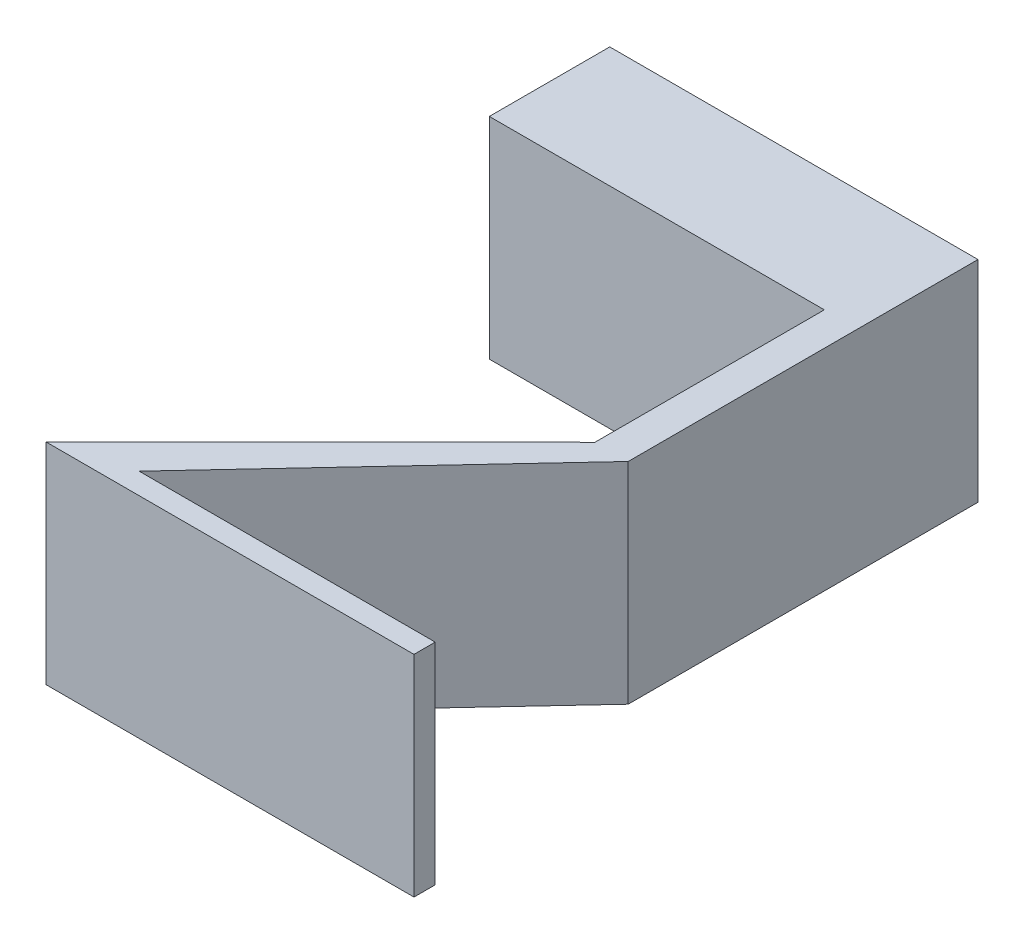
ISO-10303-21;
HEADER;
FILE_DESCRIPTION(('STEP AP214'),'2;1');
FILE_NAME('part.step','',(''),(''),'','','');
FILE_SCHEMA(('AUTOMOTIVE_DESIGN { 1 0 10303 214 1 1 1 1 }'));
ENDSEC;
DATA;
#1=APPLICATION_CONTEXT('core data for automotive mechanical design processes');
#2=APPLICATION_PROTOCOL_DEFINITION('international standard','automotive_design',2000,#1);
#3=PRODUCT_CONTEXT('',#1,'mechanical');
#4=PRODUCT('Part','Part','',(#3));
#5=PRODUCT_RELATED_PRODUCT_CATEGORY('part','',(#4));
#6=PRODUCT_DEFINITION_FORMATION('','',#4);
#7=PRODUCT_DEFINITION_CONTEXT('part definition',#1,'design');
#8=PRODUCT_DEFINITION('design','',#6,#7);
#9=PRODUCT_DEFINITION_SHAPE('','',#8);
#10=(LENGTH_UNIT() NAMED_UNIT(*) SI_UNIT(.MILLI.,.METRE.));
#11=(NAMED_UNIT(*) PLANE_ANGLE_UNIT() SI_UNIT($,.RADIAN.));
#12=(NAMED_UNIT(*) SI_UNIT($,.STERADIAN.) SOLID_ANGLE_UNIT());
#13=UNCERTAINTY_MEASURE_WITH_UNIT(LENGTH_MEASURE(1.E-05),#10,'distance_accuracy_value','');
#14=(GEOMETRIC_REPRESENTATION_CONTEXT(3) GLOBAL_UNCERTAINTY_ASSIGNED_CONTEXT((#13)) GLOBAL_UNIT_ASSIGNED_CONTEXT((#10,
#11,#12)) REPRESENTATION_CONTEXT('',''));
#15=CARTESIAN_POINT('',(0.,0.,0.));
#16=DIRECTION('',(0.,0.,1.));
#17=DIRECTION('',(1.,0.,0.));
#18=AXIS2_PLACEMENT_3D('',#15,#16,#17);
#19=CARTESIAN_POINT('',(69.7288849194825,-49.5143221903817,10.));
#20=DIRECTION('',(-1.,0.,0.));
#21=DIRECTION('',(0.,0.,1.));
#22=AXIS2_PLACEMENT_3D('',#19,#20,#21);
#23=PLANE('',#22);
#24=DIRECTION('',(0.,1.,0.));
#25=VECTOR('',#24,1.);
#26=CARTESIAN_POINT('',(69.7288849194825,-49.5143221903817,0.));
#27=LINE('',#26,#25);
#28=CARTESIAN_POINT('',(69.7288849194825,-49.5143221903817,0.));
#29=VERTEX_POINT('',#28);
#30=CARTESIAN_POINT('',(69.7288849194825,49.5143221903817,0.));
#31=VERTEX_POINT('',#30);
#32=EDGE_CURVE('E91',#29,#31,#27,.T.);
#33=ORIENTED_EDGE('',*,*,#32,.T.);
#34=DIRECTION('',(0.,0.,-1.));
#35=VECTOR('',#34,1.);
#36=CARTESIAN_POINT('',(69.7288849194825,49.5143221903817,10.));
#37=LINE('',#36,#35);
#38=CARTESIAN_POINT('',(69.7288849194825,49.5143221903817,10.));
#39=VERTEX_POINT('',#38);
#40=EDGE_CURVE('E11',#39,#31,#37,.T.);
#41=ORIENTED_EDGE('',*,*,#40,.F.);
#42=DIRECTION('',(0.,1.,0.));
#43=VECTOR('',#42,1.);
#44=CARTESIAN_POINT('',(69.7288849194825,-49.5143221903817,10.));
#45=LINE('',#44,#43);
#46=CARTESIAN_POINT('',(69.7288849194825,-49.5143221903817,10.));
#47=VERTEX_POINT('',#46);
#48=EDGE_CURVE('E85',#47,#39,#45,.T.);
#49=ORIENTED_EDGE('',*,*,#48,.F.);
#50=DIRECTION('',(0.,0.,-1.));
#51=VECTOR('',#50,1.);
#52=CARTESIAN_POINT('',(69.7288849194825,-49.5143221903817,10.));
#53=LINE('',#52,#51);
#54=EDGE_CURVE('E46',#47,#29,#53,.T.);
#55=ORIENTED_EDGE('',*,*,#54,.T.);
#56=EDGE_LOOP('',(#33,#41,#49,#55));
#57=FACE_BOUND('',#56,.T.);
#58=ADVANCED_FACE('F37',(#57),#23,.F.);
#59=CARTESIAN_POINT('',(-69.7288849194825,49.5143221903817,10.));
#60=DIRECTION('',(0.,-1.,0.));
#61=DIRECTION('',(0.,0.,-1.));
#62=AXIS2_PLACEMENT_3D('',#59,#60,#61);
#63=PLANE('',#62);
#64=DIRECTION('',(-1.,0.,0.));
#65=VECTOR('',#64,1.);
#66=CARTESIAN_POINT('',(-69.7288849194825,49.5143221903817,0.));
#67=LINE('',#66,#65);
#68=CARTESIAN_POINT('',(-69.7288849194825,49.5143221903817,0.));
#69=VERTEX_POINT('',#68);
#70=EDGE_CURVE('E67',#31,#69,#67,.T.);
#71=ORIENTED_EDGE('',*,*,#70,.T.);
#72=DIRECTION('',(0.682372411597095,0.,-0.731004714000645));
#73=VECTOR('',#72,1.);
#74=CARTESIAN_POINT('',(-69.7288849194825,49.5143221903817,0.));
#75=LINE('',#74,#73);
#76=CARTESIAN_POINT('',(41.491223437049,49.5143221903817,-119.146703645299));
#77=VERTEX_POINT('',#76);
#78=EDGE_CURVE('E114',#69,#77,#75,.T.);
#79=ORIENTED_EDGE('',*,*,#78,.T.);
#80=DIRECTION('',(0.,0.,-1.));
#81=VECTOR('',#80,1.);
#82=CARTESIAN_POINT('',(41.491223437049,49.5143221903817,-119.146703645299));
#83=LINE('',#82,#81);
#84=CARTESIAN_POINT('',(41.491223437049,49.5143221903817,-283.914864741826));
#85=VERTEX_POINT('',#84);
#86=EDGE_CURVE('E190',#77,#85,#83,.T.);
#87=ORIENTED_EDGE('',*,*,#86,.T.);
#88=DIRECTION('',(-1.,0.,0.));
#89=VECTOR('',#88,1.);
#90=CARTESIAN_POINT('',(41.491223437049,49.5143221903817,-283.914864741826));
#91=LINE('',#90,#89);
#92=CARTESIAN_POINT('',(-131.976237246755,49.5143221903817,-283.914864741826));
#93=VERTEX_POINT('',#92);
#94=EDGE_CURVE('E169',#85,#93,#91,.T.);
#95=ORIENTED_EDGE('',*,*,#94,.T.);
#96=DIRECTION('',(0.,0.,1.));
#97=VECTOR('',#96,1.);
#98=CARTESIAN_POINT('',(-131.976237246755,49.5143221903817,-283.914864741826));
#99=LINE('',#98,#97);
#100=CARTESIAN_POINT('',(-131.976237246755,49.5143221903817,-227.194526770345));
#101=VERTEX_POINT('',#100);
#102=EDGE_CURVE('E162',#93,#101,#99,.T.);
#103=ORIENTED_EDGE('',*,*,#102,.T.);
#104=DIRECTION('',(1.,0.,0.));
#105=VECTOR('',#104,1.);
#106=CARTESIAN_POINT('',(-131.976237246755,49.5143221903817,-227.194526770345));
#107=LINE('',#106,#105);
#108=CARTESIAN_POINT('',(25.829944633756,49.5143221903817,-227.194526770345));
#109=VERTEX_POINT('',#108);
#110=EDGE_CURVE('E172',#101,#109,#107,.T.);
#111=ORIENTED_EDGE('',*,*,#110,.T.);
#112=DIRECTION('',(0.,0.,1.));
#113=VECTOR('',#112,1.);
#114=CARTESIAN_POINT('',(25.829944633756,49.5143221903817,-227.194526770345));
#115=LINE('',#114,#113);
#116=CARTESIAN_POINT('',(25.829944633756,49.5143221903817,-119.146703645299));
#117=VERTEX_POINT('',#116);
#118=EDGE_CURVE('E178',#109,#117,#115,.T.);
#119=ORIENTED_EDGE('',*,*,#118,.T.);
#120=DIRECTION('',(-0.70790607082554,0.,0.706306587034516));
#121=VECTOR('',#120,1.);
#122=CARTESIAN_POINT('',(25.829944633756,49.5143221903817,-119.146703645299));
#123=LINE('',#122,#121);
#124=CARTESIAN_POINT('',(-103.609221325978,49.5143221903817,10.));
#125=VERTEX_POINT('',#124);
#126=EDGE_CURVE('E212',#117,#125,#123,.T.);
#127=ORIENTED_EDGE('',*,*,#126,.T.);
#128=DIRECTION('',(-1.,0.,0.));
#129=VECTOR('',#128,1.);
#130=CARTESIAN_POINT('',(-69.7288849194825,49.5143221903817,10.));
#131=LINE('',#130,#129);
#132=EDGE_CURVE('E224',#39,#125,#131,.T.);
#133=ORIENTED_EDGE('',*,*,#132,.F.);
#134=ORIENTED_EDGE('',*,*,#40,.T.);
#135=EDGE_LOOP('',(#71,#79,#87,#95,#103,#111,#119,#127,#133,#134));
#136=FACE_BOUND('',#135,.T.);
#137=ADVANCED_FACE('F180',(#136),#63,.F.);
#138=CARTESIAN_POINT('',(-69.7288849194825,-49.5143221903817,10.));
#139=DIRECTION('',(0.,1.,0.));
#140=DIRECTION('',(0.,0.,1.));
#141=AXIS2_PLACEMENT_3D('',#138,#139,#140);
#142=PLANE('',#141);
#143=DIRECTION('',(1.,0.,0.));
#144=VECTOR('',#143,1.);
#145=CARTESIAN_POINT('',(-69.7288849194825,-49.5143221903817,0.));
#146=LINE('',#145,#144);
#147=CARTESIAN_POINT('',(-69.7288849194825,-49.5143221903817,0.));
#148=VERTEX_POINT('',#147);
#149=EDGE_CURVE('E73',#148,#29,#146,.T.);
#150=ORIENTED_EDGE('',*,*,#149,.T.);
#151=ORIENTED_EDGE('',*,*,#54,.F.);
#152=DIRECTION('',(1.,0.,0.));
#153=VECTOR('',#152,1.);
#154=CARTESIAN_POINT('',(-69.7288849194825,-49.5143221903817,10.));
#155=LINE('',#154,#153);
#156=CARTESIAN_POINT('',(-103.609221325978,-49.5143221903817,10.));
#157=VERTEX_POINT('',#156);
#158=EDGE_CURVE('E54',#157,#47,#155,.T.);
#159=ORIENTED_EDGE('',*,*,#158,.F.);
#160=DIRECTION('',(0.70790607082554,0.,-0.706306587034516));
#161=VECTOR('',#160,1.);
#162=CARTESIAN_POINT('',(25.829944633756,-49.5143221903817,-119.146703645299));
#163=LINE('',#162,#161);
#164=CARTESIAN_POINT('',(25.829944633756,-49.5143221903817,-119.146703645299));
#165=VERTEX_POINT('',#164);
#166=EDGE_CURVE('E101',#157,#165,#163,.T.);
#167=ORIENTED_EDGE('',*,*,#166,.T.);
#168=DIRECTION('',(0.,0.,-1.));
#169=VECTOR('',#168,1.);
#170=CARTESIAN_POINT('',(25.829944633756,-49.5143221903817,-227.194526770345));
#171=LINE('',#170,#169);
#172=CARTESIAN_POINT('',(25.829944633756,-49.5143221903817,-227.194526770345));
#173=VERTEX_POINT('',#172);
#174=EDGE_CURVE('E197',#165,#173,#171,.T.);
#175=ORIENTED_EDGE('',*,*,#174,.T.);
#176=DIRECTION('',(-1.,0.,0.));
#177=VECTOR('',#176,1.);
#178=CARTESIAN_POINT('',(-131.976237246755,-49.5143221903817,-227.194526770345));
#179=LINE('',#178,#177);
#180=CARTESIAN_POINT('',(-131.976237246755,-49.5143221903817,-227.194526770345));
#181=VERTEX_POINT('',#180);
#182=EDGE_CURVE('E203',#173,#181,#179,.T.);
#183=ORIENTED_EDGE('',*,*,#182,.T.);
#184=DIRECTION('',(0.,0.,-1.));
#185=VECTOR('',#184,1.);
#186=CARTESIAN_POINT('',(-131.976237246755,-49.5143221903817,-283.914864741826));
#187=LINE('',#186,#185);
#188=CARTESIAN_POINT('',(-131.976237246755,-49.5143221903817,-283.914864741826));
#189=VERTEX_POINT('',#188);
#190=EDGE_CURVE('E164',#181,#189,#187,.T.);
#191=ORIENTED_EDGE('',*,*,#190,.T.);
#192=DIRECTION('',(1.,0.,0.));
#193=VECTOR('',#192,1.);
#194=CARTESIAN_POINT('',(41.491223437049,-49.5143221903817,-283.914864741826));
#195=LINE('',#194,#193);
#196=CARTESIAN_POINT('',(41.491223437049,-49.5143221903817,-283.914864741826));
#197=VERTEX_POINT('',#196);
#198=EDGE_CURVE('E228',#189,#197,#195,.T.);
#199=ORIENTED_EDGE('',*,*,#198,.T.);
#200=DIRECTION('',(0.,0.,1.));
#201=VECTOR('',#200,1.);
#202=CARTESIAN_POINT('',(41.491223437049,-49.5143221903817,-119.146703645299));
#203=LINE('',#202,#201);
#204=CARTESIAN_POINT('',(41.491223437049,-49.5143221903817,-119.146703645299));
#205=VERTEX_POINT('',#204);
#206=EDGE_CURVE('E231',#197,#205,#203,.T.);
#207=ORIENTED_EDGE('',*,*,#206,.T.);
#208=DIRECTION('',(-0.682372411597095,0.,0.731004714000645));
#209=VECTOR('',#208,1.);
#210=CARTESIAN_POINT('',(-69.7288849194825,-49.5143221903817,0.));
#211=LINE('',#210,#209);
#212=EDGE_CURVE('E80',#205,#148,#211,.T.);
#213=ORIENTED_EDGE('',*,*,#212,.T.);
#214=EDGE_LOOP('',(#150,#151,#159,#167,#175,#183,#191,#199,#207,#213));
#215=FACE_BOUND('',#214,.T.);
#216=ADVANCED_FACE('F75',(#215),#142,.F.);
#217=CARTESIAN_POINT('',(0.,0.,10.));
#218=DIRECTION('',(0.,0.,-1.));
#219=DIRECTION('',(-1.,0.,0.));
#220=AXIS2_PLACEMENT_3D('',#217,#218,#219);
#221=PLANE('',#220);
#222=ORIENTED_EDGE('',*,*,#48,.T.);
#223=ORIENTED_EDGE('',*,*,#132,.T.);
#224=DIRECTION('',(0.,1.,0.));
#225=VECTOR('',#224,1.);
#226=CARTESIAN_POINT('',(-103.609221325978,-243.76418739722,10.));
#227=LINE('',#226,#225);
#228=EDGE_CURVE('E209',#157,#125,#227,.T.);
#229=ORIENTED_EDGE('',*,*,#228,.F.);
#230=ORIENTED_EDGE('',*,*,#158,.T.);
#231=EDGE_LOOP('',(#222,#223,#229,#230));
#232=FACE_BOUND('',#231,.T.);
#233=ADVANCED_FACE('F243',(#232),#221,.F.);
#234=CARTESIAN_POINT('',(0.,0.,0.));
#235=DIRECTION('',(0.,0.,-1.));
#236=DIRECTION('',(-1.,0.,0.));
#237=AXIS2_PLACEMENT_3D('',#234,#235,#236);
#238=PLANE('',#237);
#239=ORIENTED_EDGE('',*,*,#32,.F.);
#240=ORIENTED_EDGE('',*,*,#149,.F.);
#241=DIRECTION('',(0.,-1.,0.));
#242=VECTOR('',#241,1.);
#243=CARTESIAN_POINT('',(-69.7288849194825,-49.5143221903817,0.));
#244=LINE('',#243,#242);
#245=EDGE_CURVE('E86',#69,#148,#244,.T.);
#246=ORIENTED_EDGE('',*,*,#245,.F.);
#247=ORIENTED_EDGE('',*,*,#70,.F.);
#248=EDGE_LOOP('',(#239,#240,#246,#247));
#249=FACE_BOUND('',#248,.T.);
#250=ADVANCED_FACE('F93',(#249),#238,.T.);
#251=CARTESIAN_POINT('',(25.829944633756,-243.76418739722,-119.146703645299));
#252=DIRECTION('',(-0.706306587034516,0.,-0.70790607082554));
#253=DIRECTION('',(-0.70790607082554,0.,0.706306587034516));
#254=AXIS2_PLACEMENT_3D('',#251,#252,#253);
#255=PLANE('',#254);
#256=ORIENTED_EDGE('',*,*,#166,.F.);
#257=ORIENTED_EDGE('',*,*,#228,.T.);
#258=ORIENTED_EDGE('',*,*,#126,.F.);
#259=DIRECTION('',(0.,1.,0.));
#260=VECTOR('',#259,1.);
#261=CARTESIAN_POINT('',(25.829944633756,-243.76418739722,-119.146703645299));
#262=LINE('',#261,#260);
#263=EDGE_CURVE('E219',#165,#117,#262,.T.);
#264=ORIENTED_EDGE('',*,*,#263,.F.);
#265=EDGE_LOOP('',(#256,#257,#258,#264));
#266=FACE_BOUND('',#265,.T.);
#267=ADVANCED_FACE('F242',(#266),#255,.T.);
#268=CARTESIAN_POINT('',(-69.7288849194825,-243.76418739722,0.));
#269=DIRECTION('',(0.731004714000645,0.,0.682372411597095));
#270=DIRECTION('',(0.682372411597095,0.,-0.731004714000645));
#271=AXIS2_PLACEMENT_3D('',#268,#269,#270);
#272=PLANE('',#271);
#273=ORIENTED_EDGE('',*,*,#212,.F.);
#274=DIRECTION('',(0.,1.,0.));
#275=VECTOR('',#274,1.);
#276=CARTESIAN_POINT('',(41.491223437049,-243.76418739722,-119.146703645299));
#277=LINE('',#276,#275);
#278=EDGE_CURVE('E216',#205,#77,#277,.T.);
#279=ORIENTED_EDGE('',*,*,#278,.T.);
#280=ORIENTED_EDGE('',*,*,#78,.F.);
#281=ORIENTED_EDGE('',*,*,#245,.T.);
#282=EDGE_LOOP('',(#273,#279,#280,#281));
#283=FACE_BOUND('',#282,.T.);
#284=ADVANCED_FACE('F111',(#283),#272,.T.);
#285=CARTESIAN_POINT('',(-131.976237246755,-288.762115967499,-283.914864741826));
#286=DIRECTION('',(-1.,0.,0.));
#287=DIRECTION('',(0.,0.,1.));
#288=AXIS2_PLACEMENT_3D('',#285,#286,#287);
#289=PLANE('',#288);
#290=ORIENTED_EDGE('',*,*,#190,.F.);
#291=DIRECTION('',(0.,1.,0.));
#292=VECTOR('',#291,1.);
#293=CARTESIAN_POINT('',(-131.976237246755,-288.762115967499,-227.194526770345));
#294=LINE('',#293,#292);
#295=EDGE_CURVE('E157',#181,#101,#294,.T.);
#296=ORIENTED_EDGE('',*,*,#295,.T.);
#297=ORIENTED_EDGE('',*,*,#102,.F.);
#298=DIRECTION('',(0.,1.,0.));
#299=VECTOR('',#298,1.);
#300=CARTESIAN_POINT('',(-131.976237246755,-288.762115967499,-283.914864741826));
#301=LINE('',#300,#299);
#302=EDGE_CURVE('E194',#189,#93,#301,.T.);
#303=ORIENTED_EDGE('',*,*,#302,.F.);
#304=EDGE_LOOP('',(#290,#296,#297,#303));
#305=FACE_BOUND('',#304,.T.);
#306=ADVANCED_FACE('F159',(#305),#289,.T.);
#307=CARTESIAN_POINT('',(41.491223437049,-288.762115967499,-283.914864741826));
#308=DIRECTION('',(0.,0.,-1.));
#309=DIRECTION('',(-1.,0.,0.));
#310=AXIS2_PLACEMENT_3D('',#307,#308,#309);
#311=PLANE('',#310);
#312=ORIENTED_EDGE('',*,*,#198,.F.);
#313=ORIENTED_EDGE('',*,*,#302,.T.);
#314=ORIENTED_EDGE('',*,*,#94,.F.);
#315=DIRECTION('',(0.,1.,0.));
#316=VECTOR('',#315,1.);
#317=CARTESIAN_POINT('',(41.491223437049,-288.762115967499,-283.914864741826));
#318=LINE('',#317,#316);
#319=EDGE_CURVE('E198',#197,#85,#318,.T.);
#320=ORIENTED_EDGE('',*,*,#319,.F.);
#321=EDGE_LOOP('',(#312,#313,#314,#320));
#322=FACE_BOUND('',#321,.T.);
#323=ADVANCED_FACE('F291',(#322),#311,.T.);
#324=CARTESIAN_POINT('',(41.491223437049,-288.762115967499,-119.146703645299));
#325=DIRECTION('',(1.,0.,0.));
#326=DIRECTION('',(0.,0.,-1.));
#327=AXIS2_PLACEMENT_3D('',#324,#325,#326);
#328=PLANE('',#327);
#329=ORIENTED_EDGE('',*,*,#206,.F.);
#330=ORIENTED_EDGE('',*,*,#319,.T.);
#331=ORIENTED_EDGE('',*,*,#86,.F.);
#332=ORIENTED_EDGE('',*,*,#278,.F.);
#333=EDGE_LOOP('',(#329,#330,#331,#332));
#334=FACE_BOUND('',#333,.T.);
#335=ADVANCED_FACE('F299',(#334),#328,.T.);
#336=CARTESIAN_POINT('',(25.829944633756,-288.762115967499,-227.194526770345));
#337=DIRECTION('',(-1.,0.,0.));
#338=DIRECTION('',(0.,0.,1.));
#339=AXIS2_PLACEMENT_3D('',#336,#337,#338);
#340=PLANE('',#339);
#341=ORIENTED_EDGE('',*,*,#174,.F.);
#342=ORIENTED_EDGE('',*,*,#263,.T.);
#343=ORIENTED_EDGE('',*,*,#118,.F.);
#344=DIRECTION('',(0.,1.,0.));
#345=VECTOR('',#344,1.);
#346=CARTESIAN_POINT('',(25.829944633756,-288.762115967499,-227.194526770345));
#347=LINE('',#346,#345);
#348=EDGE_CURVE('E168',#173,#109,#347,.T.);
#349=ORIENTED_EDGE('',*,*,#348,.F.);
#350=EDGE_LOOP('',(#341,#342,#343,#349));
#351=FACE_BOUND('',#350,.T.);
#352=ADVANCED_FACE('F239',(#351),#340,.T.);
#353=CARTESIAN_POINT('',(-131.976237246755,-288.762115967499,-227.194526770345));
#354=DIRECTION('',(0.,0.,1.));
#355=DIRECTION('',(1.,0.,0.));
#356=AXIS2_PLACEMENT_3D('',#353,#354,#355);
#357=PLANE('',#356);
#358=ORIENTED_EDGE('',*,*,#182,.F.);
#359=ORIENTED_EDGE('',*,*,#348,.T.);
#360=ORIENTED_EDGE('',*,*,#110,.F.);
#361=ORIENTED_EDGE('',*,*,#295,.F.);
#362=EDGE_LOOP('',(#358,#359,#360,#361));
#363=FACE_BOUND('',#362,.T.);
#364=ADVANCED_FACE('F173',(#363),#357,.T.);
#365=CLOSED_SHELL('',(#58,#137,#216,#233,#250,#267,#284,#306,#323,#335,#352,#364));
#366=MANIFOLD_SOLID_BREP('B2',#365);
#367=ADVANCED_BREP_SHAPE_REPRESENTATION('',(#18,#366),#14);
#368=SHAPE_DEFINITION_REPRESENTATION(#9,#367);
ENDSEC;
END-ISO-10303-21;
